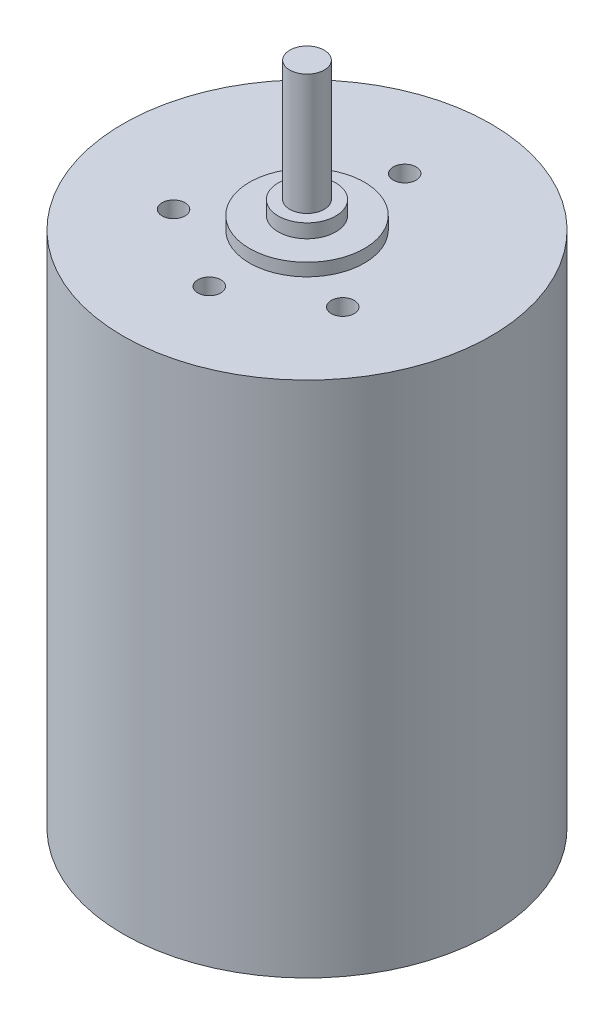
ISO-10303-21;
HEADER;
FILE_DESCRIPTION(('STEP AP214'),'2;1');
FILE_NAME('part.step','',(''),(''),'','','');
FILE_SCHEMA(('AUTOMOTIVE_DESIGN { 1 0 10303 214 1 1 1 1 }'));
ENDSEC;
DATA;
#1=APPLICATION_CONTEXT('core data for automotive mechanical design processes');
#2=APPLICATION_PROTOCOL_DEFINITION('international standard','automotive_design',2000,#1);
#3=PRODUCT_CONTEXT('',#1,'mechanical');
#4=PRODUCT('Part','Part','',(#3));
#5=PRODUCT_RELATED_PRODUCT_CATEGORY('part','',(#4));
#6=PRODUCT_DEFINITION_FORMATION('','',#4);
#7=PRODUCT_DEFINITION_CONTEXT('part definition',#1,'design');
#8=PRODUCT_DEFINITION('design','',#6,#7);
#9=PRODUCT_DEFINITION_SHAPE('','',#8);
#10=(LENGTH_UNIT() NAMED_UNIT(*) SI_UNIT(.MILLI.,.METRE.));
#11=(NAMED_UNIT(*) PLANE_ANGLE_UNIT() SI_UNIT($,.RADIAN.));
#12=(NAMED_UNIT(*) SI_UNIT($,.STERADIAN.) SOLID_ANGLE_UNIT());
#13=UNCERTAINTY_MEASURE_WITH_UNIT(LENGTH_MEASURE(1.E-05),#10,'distance_accuracy_value','');
#14=(GEOMETRIC_REPRESENTATION_CONTEXT(3) GLOBAL_UNCERTAINTY_ASSIGNED_CONTEXT((#13)) GLOBAL_UNIT_ASSIGNED_CONTEXT((#10,
#11,#12)) REPRESENTATION_CONTEXT('',''));
#15=CARTESIAN_POINT('',(0.,0.,0.));
#16=DIRECTION('',(0.,0.,1.));
#17=DIRECTION('',(1.,0.,0.));
#18=AXIS2_PLACEMENT_3D('',#15,#16,#17);
#19=CARTESIAN_POINT('',(0.,-45.05,0.));
#20=DIRECTION('',(0.,1.,0.));
#21=DIRECTION('',(0.,0.,1.));
#22=AXIS2_PLACEMENT_3D('',#19,#20,#21);
#23=CYLINDRICAL_SURFACE('',#22,16.);
#24=CARTESIAN_POINT('',(0.,-45.05,0.));
#25=DIRECTION('',(0.,1.,0.));
#26=DIRECTION('',(0.,0.,1.));
#27=AXIS2_PLACEMENT_3D('',#24,#25,#26);
#28=CIRCLE('',#27,16.);
#29=CARTESIAN_POINT('',(0.,-45.05,16.));
#30=VERTEX_POINT('',#29);
#31=EDGE_CURVE('E73',#30,#30,#28,.T.);
#32=ORIENTED_EDGE('',*,*,#31,.T.);
#33=EDGE_LOOP('',(#32));
#34=FACE_BOUND('',#33,.T.);
#35=CARTESIAN_POINT('',(0.,0.,0.));
#36=DIRECTION('',(0.,1.,0.));
#37=DIRECTION('',(0.,0.,1.));
#38=AXIS2_PLACEMENT_3D('',#35,#36,#37);
#39=CIRCLE('',#38,16.);
#40=CARTESIAN_POINT('',(0.,0.,16.));
#41=VERTEX_POINT('',#40);
#42=EDGE_CURVE('E46',#41,#41,#39,.T.);
#43=ORIENTED_EDGE('',*,*,#42,.F.);
#44=EDGE_LOOP('',(#43));
#45=FACE_BOUND('',#44,.T.);
#46=ADVANCED_FACE('F43',(#34,#45),#23,.T.);
#47=CARTESIAN_POINT('',(0.,-45.05,0.));
#48=DIRECTION('',(0.,1.,0.));
#49=DIRECTION('',(0.,0.,1.));
#50=AXIS2_PLACEMENT_3D('',#47,#48,#49);
#51=PLANE('',#50);
#52=ORIENTED_EDGE('',*,*,#31,.F.);
#53=EDGE_LOOP('',(#52));
#54=FACE_BOUND('',#53,.T.);
#55=ADVANCED_FACE('F85',(#54),#51,.F.);
#56=CARTESIAN_POINT('',(0.,0.,0.));
#57=DIRECTION('',(0.,1.,0.));
#58=DIRECTION('',(0.,0.,1.));
#59=AXIS2_PLACEMENT_3D('',#56,#57,#58);
#60=PLANE('',#59);
#61=CARTESIAN_POINT('',(0.,0.,-8.5));
#62=DIRECTION('',(0.,1.,0.));
#63=DIRECTION('',(0.,0.,1.));
#64=AXIS2_PLACEMENT_3D('',#61,#62,#63);
#65=CIRCLE('',#64,1.);
#66=CARTESIAN_POINT('',(0.,0.,-7.5));
#67=VERTEX_POINT('',#66);
#68=EDGE_CURVE('E157',#67,#67,#65,.T.);
#69=ORIENTED_EDGE('',*,*,#68,.F.);
#70=EDGE_LOOP('',(#69));
#71=FACE_BOUND('',#70,.T.);
#72=CARTESIAN_POINT('',(0.,0.,8.5));
#73=DIRECTION('',(0.,1.,0.));
#74=DIRECTION('',(0.,0.,1.));
#75=AXIS2_PLACEMENT_3D('',#72,#73,#74);
#76=CIRCLE('',#75,1.);
#77=CARTESIAN_POINT('',(0.,0.,9.5));
#78=VERTEX_POINT('',#77);
#79=EDGE_CURVE('E163',#78,#78,#76,.T.);
#80=ORIENTED_EDGE('',*,*,#79,.F.);
#81=EDGE_LOOP('',(#80));
#82=FACE_BOUND('',#81,.T.);
#83=CARTESIAN_POINT('',(-7.36121593216771,0.,4.25000000000004));
#84=DIRECTION('',(0.,1.,0.));
#85=DIRECTION('',(0.,0.,1.));
#86=AXIS2_PLACEMENT_3D('',#83,#84,#85);
#87=CIRCLE('',#86,1.);
#88=CARTESIAN_POINT('',(-7.36121593216771,0.,5.25000000000004));
#89=VERTEX_POINT('',#88);
#90=EDGE_CURVE('E173',#89,#89,#87,.T.);
#91=ORIENTED_EDGE('',*,*,#90,.F.);
#92=EDGE_LOOP('',(#91));
#93=FACE_BOUND('',#92,.T.);
#94=CARTESIAN_POINT('',(7.36121593216774,0.,4.24999999999998));
#95=DIRECTION('',(0.,1.,0.));
#96=DIRECTION('',(0.,0.,1.));
#97=AXIS2_PLACEMENT_3D('',#94,#95,#96);
#98=CIRCLE('',#97,1.);
#99=CARTESIAN_POINT('',(7.36121593216774,0.,5.24999999999998));
#100=VERTEX_POINT('',#99);
#101=EDGE_CURVE('E181',#100,#100,#98,.T.);
#102=ORIENTED_EDGE('',*,*,#101,.F.);
#103=EDGE_LOOP('',(#102));
#104=FACE_BOUND('',#103,.T.);
#105=CARTESIAN_POINT('',(0.,0.,0.));
#106=DIRECTION('',(0.,1.,0.));
#107=DIRECTION('',(0.,0.,1.));
#108=AXIS2_PLACEMENT_3D('',#105,#106,#107);
#109=CIRCLE('',#108,5.);
#110=CARTESIAN_POINT('',(0.,0.,5.));
#111=VERTEX_POINT('',#110);
#112=EDGE_CURVE('E57',#111,#111,#109,.T.);
#113=ORIENTED_EDGE('',*,*,#112,.F.);
#114=EDGE_LOOP('',(#113));
#115=FACE_BOUND('',#114,.T.);
#116=ORIENTED_EDGE('',*,*,#42,.T.);
#117=EDGE_LOOP('',(#116));
#118=FACE_BOUND('',#117,.T.);
#119=ADVANCED_FACE('F82',(#71,#82,#93,#104,#115,#118),#60,.T.);
#120=CARTESIAN_POINT('',(0.,1.1,0.));
#121=DIRECTION('',(0.,-1.,0.));
#122=DIRECTION('',(0.,0.,-1.));
#123=AXIS2_PLACEMENT_3D('',#120,#121,#122);
#124=CYLINDRICAL_SURFACE('',#123,5.);
#125=CARTESIAN_POINT('',(0.,1.1,0.));
#126=DIRECTION('',(0.,1.,0.));
#127=DIRECTION('',(0.,0.,1.));
#128=AXIS2_PLACEMENT_3D('',#125,#126,#127);
#129=CIRCLE('',#128,5.);
#130=CARTESIAN_POINT('',(0.,1.1,5.));
#131=VERTEX_POINT('',#130);
#132=EDGE_CURVE('E66',#131,#131,#129,.T.);
#133=ORIENTED_EDGE('',*,*,#132,.F.);
#134=EDGE_LOOP('',(#133));
#135=FACE_BOUND('',#134,.T.);
#136=ORIENTED_EDGE('',*,*,#112,.T.);
#137=EDGE_LOOP('',(#136));
#138=FACE_BOUND('',#137,.T.);
#139=ADVANCED_FACE('F94',(#135,#138),#124,.T.);
#140=CARTESIAN_POINT('',(0.,1.1,0.));
#141=DIRECTION('',(0.,1.,0.));
#142=DIRECTION('',(0.,0.,1.));
#143=AXIS2_PLACEMENT_3D('',#140,#141,#142);
#144=PLANE('',#143);
#145=CARTESIAN_POINT('',(0.,1.1,0.));
#146=DIRECTION('',(0.,1.,0.));
#147=DIRECTION('',(0.,0.,1.));
#148=AXIS2_PLACEMENT_3D('',#145,#146,#147);
#149=CIRCLE('',#148,2.5);
#150=CARTESIAN_POINT('',(0.,1.1,2.5));
#151=VERTEX_POINT('',#150);
#152=EDGE_CURVE('E51',#151,#151,#149,.T.);
#153=ORIENTED_EDGE('',*,*,#152,.F.);
#154=EDGE_LOOP('',(#153));
#155=FACE_BOUND('',#154,.T.);
#156=ORIENTED_EDGE('',*,*,#132,.T.);
#157=EDGE_LOOP('',(#156));
#158=FACE_BOUND('',#157,.T.);
#159=ADVANCED_FACE('F99',(#155,#158),#144,.T.);
#160=CARTESIAN_POINT('',(0.,2.3,0.));
#161=DIRECTION('',(0.,-1.,0.));
#162=DIRECTION('',(0.,0.,-1.));
#163=AXIS2_PLACEMENT_3D('',#160,#161,#162);
#164=CYLINDRICAL_SURFACE('',#163,2.5);
#165=CARTESIAN_POINT('',(0.,2.3,0.));
#166=DIRECTION('',(0.,1.,0.));
#167=DIRECTION('',(0.,0.,1.));
#168=AXIS2_PLACEMENT_3D('',#165,#166,#167);
#169=CIRCLE('',#168,2.5);
#170=CARTESIAN_POINT('',(0.,2.3,2.5));
#171=VERTEX_POINT('',#170);
#172=EDGE_CURVE('E63',#171,#171,#169,.T.);
#173=ORIENTED_EDGE('',*,*,#172,.F.);
#174=EDGE_LOOP('',(#173));
#175=FACE_BOUND('',#174,.T.);
#176=ORIENTED_EDGE('',*,*,#152,.T.);
#177=EDGE_LOOP('',(#176));
#178=FACE_BOUND('',#177,.T.);
#179=ADVANCED_FACE('F103',(#175,#178),#164,.T.);
#180=CARTESIAN_POINT('',(0.,2.3,0.));
#181=DIRECTION('',(0.,1.,0.));
#182=DIRECTION('',(0.,0.,1.));
#183=AXIS2_PLACEMENT_3D('',#180,#181,#182);
#184=PLANE('',#183);
#185=CARTESIAN_POINT('',(0.,2.3,0.));
#186=DIRECTION('',(0.,1.,0.));
#187=DIRECTION('',(0.,0.,1.));
#188=AXIS2_PLACEMENT_3D('',#185,#186,#187);
#189=CIRCLE('',#188,1.5);
#190=CARTESIAN_POINT('',(0.,2.3,-1.5));
#191=VERTEX_POINT('',#190);
#192=EDGE_CURVE('E10',#191,#191,#189,.T.);
#193=ORIENTED_EDGE('',*,*,#192,.F.);
#194=EDGE_LOOP('',(#193));
#195=FACE_BOUND('',#194,.T.);
#196=ORIENTED_EDGE('',*,*,#172,.T.);
#197=EDGE_LOOP('',(#196));
#198=FACE_BOUND('',#197,.T.);
#199=ADVANCED_FACE('F107',(#195,#198),#184,.T.);
#200=CARTESIAN_POINT('',(0.,12.8,0.));
#201=DIRECTION('',(0.,-1.,0.));
#202=DIRECTION('',(0.,0.,-1.));
#203=AXIS2_PLACEMENT_3D('',#200,#201,#202);
#204=CYLINDRICAL_SURFACE('',#203,1.5);
#205=CARTESIAN_POINT('',(0.,12.8,0.));
#206=DIRECTION('',(0.,1.,0.));
#207=DIRECTION('',(0.,0.,1.));
#208=AXIS2_PLACEMENT_3D('',#205,#206,#207);
#209=CIRCLE('',#208,1.5);
#210=CARTESIAN_POINT('',(0.,12.8,-1.5));
#211=VERTEX_POINT('',#210);
#212=EDGE_CURVE('E61',#211,#211,#209,.T.);
#213=CARTESIAN_POINT('',(0.,12.8,-1.5));
#214=CARTESIAN_POINT('',(0.,12.690625,-1.5));
#215=CARTESIAN_POINT('',(0.,12.58125,-1.5));
#216=CARTESIAN_POINT('',(0.,12.3625,-1.5));
#217=CARTESIAN_POINT('',(0.,12.253125,-1.5));
#218=CARTESIAN_POINT('',(0.,12.034375,-1.5));
#219=CARTESIAN_POINT('',(0.,11.925,-1.5));
#220=CARTESIAN_POINT('',(0.,11.70625,-1.5));
#221=CARTESIAN_POINT('',(0.,11.596875,-1.5));
#222=CARTESIAN_POINT('',(0.,11.378125,-1.5));
#223=CARTESIAN_POINT('',(0.,11.26875,-1.5));
#224=CARTESIAN_POINT('',(0.,11.05,-1.5));
#225=CARTESIAN_POINT('',(0.,10.940625,-1.5));
#226=CARTESIAN_POINT('',(0.,10.721875,-1.5));
#227=CARTESIAN_POINT('',(0.,10.6125,-1.5));
#228=CARTESIAN_POINT('',(0.,10.39375,-1.5));
#229=CARTESIAN_POINT('',(0.,10.284375,-1.5));
#230=CARTESIAN_POINT('',(0.,10.065625,-1.5));
#231=CARTESIAN_POINT('',(0.,9.95625,-1.5));
#232=CARTESIAN_POINT('',(0.,9.7375,-1.5));
#233=CARTESIAN_POINT('',(0.,9.628125,-1.5));
#234=CARTESIAN_POINT('',(0.,9.409375,-1.5));
#235=CARTESIAN_POINT('',(0.,9.3,-1.5));
#236=CARTESIAN_POINT('',(0.,9.08125,-1.5));
#237=CARTESIAN_POINT('',(0.,8.971875,-1.5));
#238=CARTESIAN_POINT('',(0.,8.753125,-1.5));
#239=CARTESIAN_POINT('',(0.,8.64375,-1.5));
#240=CARTESIAN_POINT('',(0.,8.425,-1.5));
#241=CARTESIAN_POINT('',(0.,8.315625,-1.5));
#242=CARTESIAN_POINT('',(0.,8.096875,-1.5));
#243=CARTESIAN_POINT('',(0.,7.9875,-1.5));
#244=CARTESIAN_POINT('',(0.,7.76875,-1.5));
#245=CARTESIAN_POINT('',(0.,7.659375,-1.5));
#246=CARTESIAN_POINT('',(0.,7.440625,-1.5));
#247=CARTESIAN_POINT('',(0.,7.33125,-1.5));
#248=CARTESIAN_POINT('',(0.,7.1125,-1.5));
#249=CARTESIAN_POINT('',(0.,7.003125,-1.5));
#250=CARTESIAN_POINT('',(0.,6.784375,-1.5));
#251=CARTESIAN_POINT('',(0.,6.675,-1.5));
#252=CARTESIAN_POINT('',(0.,6.45625,-1.5));
#253=CARTESIAN_POINT('',(0.,6.346875,-1.5));
#254=CARTESIAN_POINT('',(0.,6.128125,-1.5));
#255=CARTESIAN_POINT('',(0.,6.01875,-1.5));
#256=CARTESIAN_POINT('',(0.,5.8,-1.5));
#257=CARTESIAN_POINT('',(0.,5.690625,-1.5));
#258=CARTESIAN_POINT('',(0.,5.471875,-1.5));
#259=CARTESIAN_POINT('',(0.,5.3625,-1.5));
#260=CARTESIAN_POINT('',(0.,5.14375,-1.5));
#261=CARTESIAN_POINT('',(0.,5.034375,-1.5));
#262=CARTESIAN_POINT('',(0.,4.815625,-1.5));
#263=CARTESIAN_POINT('',(0.,4.70625,-1.5));
#264=CARTESIAN_POINT('',(0.,4.4875,-1.5));
#265=CARTESIAN_POINT('',(0.,4.378125,-1.5));
#266=CARTESIAN_POINT('',(0.,4.159375,-1.5));
#267=CARTESIAN_POINT('',(0.,4.05,-1.5));
#268=CARTESIAN_POINT('',(0.,3.83125,-1.5));
#269=CARTESIAN_POINT('',(0.,3.721875,-1.5));
#270=CARTESIAN_POINT('',(0.,3.503125,-1.5));
#271=CARTESIAN_POINT('',(0.,3.39375,-1.5));
#272=CARTESIAN_POINT('',(0.,3.175,-1.5));
#273=CARTESIAN_POINT('',(0.,3.065625,-1.5));
#274=CARTESIAN_POINT('',(0.,2.846875,-1.5));
#275=CARTESIAN_POINT('',(0.,2.7375,-1.5));
#276=CARTESIAN_POINT('',(0.,2.51875,-1.5));
#277=CARTESIAN_POINT('',(0.,2.409375,-1.5));
#278=CARTESIAN_POINT('',(0.,2.3,-1.5));
#279=B_SPLINE_CURVE_WITH_KNOTS('',3,(#213,#214,#215,#216,#217,#218,#219,#220,#221,#222,#223,
#224,#225,#226,#227,#228,#229,#230,#231,#232,#233,#234,#235,#236,#237,#238,#239,#240,#241,#242,
#243,#244,#245,#246,#247,#248,#249,#250,#251,#252,#253,#254,#255,#256,#257,#258,#259,#260,#261,
#262,#263,#264,#265,#266,#267,#268,#269,#270,#271,#272,#273,#274,#275,#276,#277,#278),
.UNSPECIFIED.,.F.,.F.,(4,2,2,2,2,2,2,2,2,2,2,2,2,2,2,2,2,2,2,2,2,2,2,2,2,2,2,2,2,2,2,2,4),(0.,
0.328124999999999,0.656249999999999,0.984374999999999,1.3125,1.640625,1.96875,2.296875,2.625,
2.953125,3.28125,3.609375,3.9375,4.265625,4.59375,4.921875,5.25,5.578125,5.90625,6.234375,
6.5625,6.890625,7.21875,7.546875,7.875,8.203125,8.53125,8.859375,9.1875,9.515625,9.84375,
10.171875,10.5),.UNSPECIFIED.);
#280=EDGE_CURVE('BSEAM111',#211,#191,#279,.T.);
#281=ORIENTED_EDGE('',*,*,#212,.F.);
#282=ORIENTED_EDGE('',*,*,#192,.T.);
#283=ORIENTED_EDGE('',*,*,#280,.T.);
#284=ORIENTED_EDGE('',*,*,#280,.F.);
#285=EDGE_LOOP('',(#281,#283,#282,#284));
#286=FACE_BOUND('',#285,.T.);
#287=ADVANCED_FACE('F111',(#286),#204,.T.);
#288=CARTESIAN_POINT('',(0.,12.8,0.));
#289=DIRECTION('',(0.,1.,0.));
#290=DIRECTION('',(0.,0.,1.));
#291=AXIS2_PLACEMENT_3D('',#288,#289,#290);
#292=PLANE('',#291);
#293=ORIENTED_EDGE('',*,*,#212,.T.);
#294=EDGE_LOOP('',(#293));
#295=FACE_BOUND('',#294,.T.);
#296=ADVANCED_FACE('F115',(#295),#292,.T.);
#297=CARTESIAN_POINT('',(7.36121593216774,-3.6,4.24999999999998));
#298=DIRECTION('',(0.,1.,0.));
#299=DIRECTION('',(0.,0.,1.));
#300=AXIS2_PLACEMENT_3D('',#297,#298,#299);
#301=CYLINDRICAL_SURFACE('',#300,1.);
#302=CARTESIAN_POINT('',(7.36121593216774,-3.6,4.24999999999998));
#303=DIRECTION('',(0.,1.,0.));
#304=DIRECTION('',(0.,0.,1.));
#305=AXIS2_PLACEMENT_3D('',#302,#303,#304);
#306=CIRCLE('',#305,1.);
#307=CARTESIAN_POINT('',(7.36121593216774,-3.6,5.24999999999998));
#308=VERTEX_POINT('',#307);
#309=EDGE_CURVE('E184',#308,#308,#306,.T.);
#310=ORIENTED_EDGE('',*,*,#309,.F.);
#311=EDGE_LOOP('',(#310));
#312=FACE_BOUND('',#311,.T.);
#313=ORIENTED_EDGE('',*,*,#101,.T.);
#314=EDGE_LOOP('',(#313));
#315=FACE_BOUND('',#314,.T.);
#316=ADVANCED_FACE('F119',(#312,#315),#301,.F.);
#317=CARTESIAN_POINT('',(7.36121593216774,-3.6,4.24999999999998));
#318=DIRECTION('',(0.,1.,0.));
#319=DIRECTION('',(0.,0.,1.));
#320=AXIS2_PLACEMENT_3D('',#317,#318,#319);
#321=PLANE('',#320);
#322=ORIENTED_EDGE('',*,*,#309,.T.);
#323=EDGE_LOOP('',(#322));
#324=FACE_BOUND('',#323,.T.);
#325=ADVANCED_FACE('F121',(#324),#321,.T.);
#326=CARTESIAN_POINT('',(-7.36121593216771,-3.6,4.25000000000004));
#327=DIRECTION('',(0.,1.,0.));
#328=DIRECTION('',(0.,0.,1.));
#329=AXIS2_PLACEMENT_3D('',#326,#327,#328);
#330=CYLINDRICAL_SURFACE('',#329,1.);
#331=CARTESIAN_POINT('',(-7.36121593216771,-3.6,4.25000000000004));
#332=DIRECTION('',(0.,1.,0.));
#333=DIRECTION('',(0.,0.,1.));
#334=AXIS2_PLACEMENT_3D('',#331,#332,#333);
#335=CIRCLE('',#334,1.);
#336=CARTESIAN_POINT('',(-7.36121593216771,-3.6,5.25000000000004));
#337=VERTEX_POINT('',#336);
#338=EDGE_CURVE('E177',#337,#337,#335,.T.);
#339=ORIENTED_EDGE('',*,*,#338,.F.);
#340=EDGE_LOOP('',(#339));
#341=FACE_BOUND('',#340,.T.);
#342=ORIENTED_EDGE('',*,*,#90,.T.);
#343=EDGE_LOOP('',(#342));
#344=FACE_BOUND('',#343,.T.);
#345=ADVANCED_FACE('F124',(#341,#344),#330,.F.);
#346=CARTESIAN_POINT('',(-7.36121593216771,-3.6,4.25000000000004));
#347=DIRECTION('',(0.,1.,0.));
#348=DIRECTION('',(0.,0.,1.));
#349=AXIS2_PLACEMENT_3D('',#346,#347,#348);
#350=PLANE('',#349);
#351=ORIENTED_EDGE('',*,*,#338,.T.);
#352=EDGE_LOOP('',(#351));
#353=FACE_BOUND('',#352,.T.);
#354=ADVANCED_FACE('F129',(#353),#350,.T.);
#355=CARTESIAN_POINT('',(0.,-3.6,8.5));
#356=DIRECTION('',(0.,1.,0.));
#357=DIRECTION('',(0.,0.,1.));
#358=AXIS2_PLACEMENT_3D('',#355,#356,#357);
#359=CYLINDRICAL_SURFACE('',#358,1.);
#360=CARTESIAN_POINT('',(0.,-3.6,8.5));
#361=DIRECTION('',(0.,1.,0.));
#362=DIRECTION('',(0.,0.,1.));
#363=AXIS2_PLACEMENT_3D('',#360,#361,#362);
#364=CIRCLE('',#363,1.);
#365=CARTESIAN_POINT('',(0.,-3.6,9.5));
#366=VERTEX_POINT('',#365);
#367=EDGE_CURVE('E169',#366,#366,#364,.T.);
#368=ORIENTED_EDGE('',*,*,#367,.F.);
#369=EDGE_LOOP('',(#368));
#370=FACE_BOUND('',#369,.T.);
#371=ORIENTED_EDGE('',*,*,#79,.T.);
#372=EDGE_LOOP('',(#371));
#373=FACE_BOUND('',#372,.T.);
#374=ADVANCED_FACE('F132',(#370,#373),#359,.F.);
#375=CARTESIAN_POINT('',(0.,-3.6,8.5));
#376=DIRECTION('',(0.,1.,0.));
#377=DIRECTION('',(0.,0.,1.));
#378=AXIS2_PLACEMENT_3D('',#375,#376,#377);
#379=PLANE('',#378);
#380=ORIENTED_EDGE('',*,*,#367,.T.);
#381=EDGE_LOOP('',(#380));
#382=FACE_BOUND('',#381,.T.);
#383=ADVANCED_FACE('F137',(#382),#379,.T.);
#384=CARTESIAN_POINT('',(0.,-3.6,-8.5));
#385=DIRECTION('',(0.,1.,0.));
#386=DIRECTION('',(0.,0.,1.));
#387=AXIS2_PLACEMENT_3D('',#384,#385,#386);
#388=CYLINDRICAL_SURFACE('',#387,1.);
#389=CARTESIAN_POINT('',(0.,-3.6,-8.5));
#390=DIRECTION('',(0.,1.,0.));
#391=DIRECTION('',(0.,0.,1.));
#392=AXIS2_PLACEMENT_3D('',#389,#390,#391);
#393=CIRCLE('',#392,1.);
#394=CARTESIAN_POINT('',(0.,-3.6,-7.5));
#395=VERTEX_POINT('',#394);
#396=EDGE_CURVE('E155',#395,#395,#393,.T.);
#397=ORIENTED_EDGE('',*,*,#396,.F.);
#398=EDGE_LOOP('',(#397));
#399=FACE_BOUND('',#398,.T.);
#400=ORIENTED_EDGE('',*,*,#68,.T.);
#401=EDGE_LOOP('',(#400));
#402=FACE_BOUND('',#401,.T.);
#403=ADVANCED_FACE('F140',(#399,#402),#388,.F.);
#404=CARTESIAN_POINT('',(0.,-3.6,-8.5));
#405=DIRECTION('',(0.,1.,0.));
#406=DIRECTION('',(0.,0.,1.));
#407=AXIS2_PLACEMENT_3D('',#404,#405,#406);
#408=PLANE('',#407);
#409=ORIENTED_EDGE('',*,*,#396,.T.);
#410=EDGE_LOOP('',(#409));
#411=FACE_BOUND('',#410,.T.);
#412=ADVANCED_FACE('F147',(#411),#408,.T.);
#413=CLOSED_SHELL('',(#46,#55,#119,#139,#159,#179,#199,#287,#296,#316,#325,#345,#354,#374,#383,
#403,#412));
#414=MANIFOLD_SOLID_BREP('B2',#413);
#415=ADVANCED_BREP_SHAPE_REPRESENTATION('',(#18,#414),#14);
#416=SHAPE_DEFINITION_REPRESENTATION(#9,#415);
ENDSEC;
END-ISO-10303-21;
